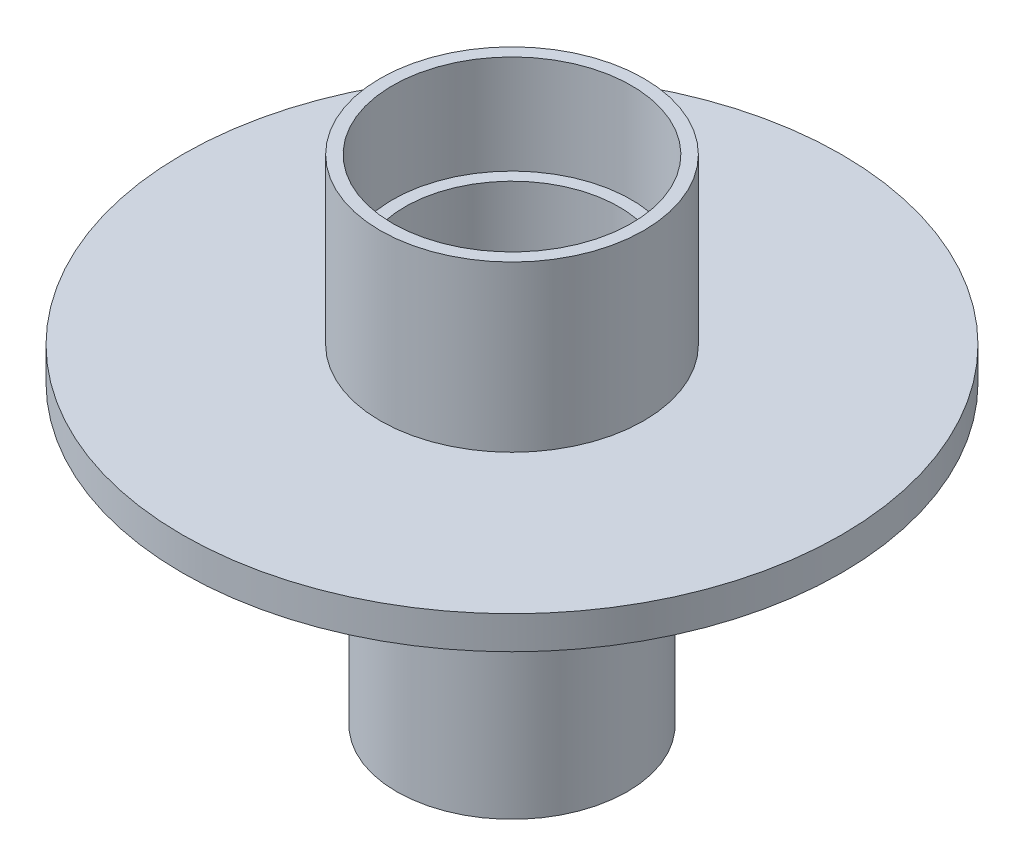
ISO-10303-21;
HEADER;
FILE_DESCRIPTION(('STEP AP214'),'2;1');
FILE_NAME('part.step','',(''),(''),'','','');
FILE_SCHEMA(('AUTOMOTIVE_DESIGN { 1 0 10303 214 1 1 1 1 }'));
ENDSEC;
DATA;
#1=APPLICATION_CONTEXT('core data for automotive mechanical design processes');
#2=APPLICATION_PROTOCOL_DEFINITION('international standard','automotive_design',2000,#1);
#3=PRODUCT_CONTEXT('',#1,'mechanical');
#4=PRODUCT('Part','Part','',(#3));
#5=PRODUCT_RELATED_PRODUCT_CATEGORY('part','',(#4));
#6=PRODUCT_DEFINITION_FORMATION('','',#4);
#7=PRODUCT_DEFINITION_CONTEXT('part definition',#1,'design');
#8=PRODUCT_DEFINITION('design','',#6,#7);
#9=PRODUCT_DEFINITION_SHAPE('','',#8);
#10=(LENGTH_UNIT() NAMED_UNIT(*) SI_UNIT(.MILLI.,.METRE.));
#11=(NAMED_UNIT(*) PLANE_ANGLE_UNIT() SI_UNIT($,.RADIAN.));
#12=(NAMED_UNIT(*) SI_UNIT($,.STERADIAN.) SOLID_ANGLE_UNIT());
#13=UNCERTAINTY_MEASURE_WITH_UNIT(LENGTH_MEASURE(1.E-05),#10,'distance_accuracy_value','');
#14=(GEOMETRIC_REPRESENTATION_CONTEXT(3) GLOBAL_UNCERTAINTY_ASSIGNED_CONTEXT((#13)) GLOBAL_UNIT_ASSIGNED_CONTEXT((#10,
#11,#12)) REPRESENTATION_CONTEXT('',''));
#15=CARTESIAN_POINT('',(0.,0.,0.));
#16=DIRECTION('',(0.,0.,1.));
#17=DIRECTION('',(1.,0.,0.));
#18=AXIS2_PLACEMENT_3D('',#15,#16,#17);
#19=CARTESIAN_POINT('',(0.,-0.626106049824934,40.));
#20=DIRECTION('',(0.,-1.,0.));
#21=DIRECTION('',(0.,0.,-1.));
#22=AXIS2_PLACEMENT_3D('',#19,#20,#21);
#23=PLANE('',#22);
#24=CARTESIAN_POINT('',(0.,-0.626106049824934,0.));
#25=DIRECTION('',(0.,1.,0.));
#26=DIRECTION('',(0.,0.,1.));
#27=AXIS2_PLACEMENT_3D('',#24,#25,#26);
#28=CIRCLE('',#27,14.);
#29=CARTESIAN_POINT('',(0.,-0.626106049824934,14.));
#30=VERTEX_POINT('',#29);
#31=EDGE_CURVE('E80',#30,#30,#28,.T.);
#32=ORIENTED_EDGE('',*,*,#31,.T.);
#33=EDGE_LOOP('',(#32));
#34=FACE_BOUND('',#33,.T.);
#35=CARTESIAN_POINT('',(0.,-0.626106049824934,0.));
#36=DIRECTION('',(0.,1.,0.));
#37=DIRECTION('',(0.,0.,1.));
#38=AXIS2_PLACEMENT_3D('',#35,#36,#37);
#39=CIRCLE('',#38,40.);
#40=CARTESIAN_POINT('',(0.,-0.626106049824934,40.));
#41=VERTEX_POINT('',#40);
#42=EDGE_CURVE('E10',#41,#41,#39,.T.);
#43=ORIENTED_EDGE('',*,*,#42,.F.);
#44=EDGE_LOOP('',(#43));
#45=FACE_BOUND('',#44,.T.);
#46=ADVANCED_FACE('F37',(#34,#45),#23,.T.);
#47=CARTESIAN_POINT('',(0.,28.0586262240942,0.));
#48=DIRECTION('',(0.,1.,0.));
#49=DIRECTION('',(0.,0.,1.));
#50=AXIS2_PLACEMENT_3D('',#47,#48,#49);
#51=CYLINDRICAL_SURFACE('',#50,40.);
#52=ORIENTED_EDGE('',*,*,#42,.T.);
#53=EDGE_LOOP('',(#52));
#54=FACE_BOUND('',#53,.T.);
#55=CARTESIAN_POINT('',(0.,3.37389395017507,0.));
#56=DIRECTION('',(0.,1.,0.));
#57=DIRECTION('',(0.,0.,1.));
#58=AXIS2_PLACEMENT_3D('',#55,#56,#57);
#59=CIRCLE('',#58,40.);
#60=CARTESIAN_POINT('',(0.,3.37389395017507,40.));
#61=VERTEX_POINT('',#60);
#62=EDGE_CURVE('E44',#61,#61,#59,.T.);
#63=ORIENTED_EDGE('',*,*,#62,.F.);
#64=EDGE_LOOP('',(#63));
#65=FACE_BOUND('',#64,.T.);
#66=ADVANCED_FACE('F99',(#54,#65),#51,.T.);
#67=CARTESIAN_POINT('',(0.,3.37389395017507,16.));
#68=DIRECTION('',(0.,1.,0.));
#69=DIRECTION('',(0.,0.,1.));
#70=AXIS2_PLACEMENT_3D('',#67,#68,#69);
#71=PLANE('',#70);
#72=ORIENTED_EDGE('',*,*,#62,.T.);
#73=EDGE_LOOP('',(#72));
#74=FACE_BOUND('',#73,.T.);
#75=CARTESIAN_POINT('',(0.,3.37389395017507,0.));
#76=DIRECTION('',(0.,1.,0.));
#77=DIRECTION('',(0.,0.,1.));
#78=AXIS2_PLACEMENT_3D('',#75,#76,#77);
#79=CIRCLE('',#78,16.);
#80=CARTESIAN_POINT('',(0.,3.37389395017507,16.));
#81=VERTEX_POINT('',#80);
#82=EDGE_CURVE('E49',#81,#81,#79,.T.);
#83=ORIENTED_EDGE('',*,*,#82,.F.);
#84=EDGE_LOOP('',(#83));
#85=FACE_BOUND('',#84,.T.);
#86=ADVANCED_FACE('F103',(#74,#85),#71,.T.);
#87=CARTESIAN_POINT('',(0.,28.0586262240942,0.));
#88=DIRECTION('',(0.,1.,0.));
#89=DIRECTION('',(0.,0.,1.));
#90=AXIS2_PLACEMENT_3D('',#87,#88,#89);
#91=CYLINDRICAL_SURFACE('',#90,16.);
#92=ORIENTED_EDGE('',*,*,#82,.T.);
#93=EDGE_LOOP('',(#92));
#94=FACE_BOUND('',#93,.T.);
#95=CARTESIAN_POINT('',(0.,23.3738939501751,0.));
#96=DIRECTION('',(0.,1.,0.));
#97=DIRECTION('',(0.,0.,1.));
#98=AXIS2_PLACEMENT_3D('',#95,#96,#97);
#99=CIRCLE('',#98,16.);
#100=CARTESIAN_POINT('',(0.,23.3738939501751,16.));
#101=VERTEX_POINT('',#100);
#102=EDGE_CURVE('E54',#101,#101,#99,.T.);
#103=ORIENTED_EDGE('',*,*,#102,.F.);
#104=EDGE_LOOP('',(#103));
#105=FACE_BOUND('',#104,.T.);
#106=ADVANCED_FACE('F107',(#94,#105),#91,.T.);
#107=CARTESIAN_POINT('',(0.,23.3738939501751,16.));
#108=DIRECTION('',(0.,1.,0.));
#109=DIRECTION('',(0.,0.,1.));
#110=AXIS2_PLACEMENT_3D('',#107,#108,#109);
#111=PLANE('',#110);
#112=ORIENTED_EDGE('',*,*,#102,.T.);
#113=EDGE_LOOP('',(#112));
#114=FACE_BOUND('',#113,.T.);
#115=CARTESIAN_POINT('',(0.,23.3738939501751,0.));
#116=DIRECTION('',(0.,1.,0.));
#117=DIRECTION('',(0.,0.,1.));
#118=AXIS2_PLACEMENT_3D('',#115,#116,#117);
#119=CIRCLE('',#118,14.5);
#120=CARTESIAN_POINT('',(0.,23.3738939501751,14.5));
#121=VERTEX_POINT('',#120);
#122=EDGE_CURVE('E60',#121,#121,#119,.T.);
#123=ORIENTED_EDGE('',*,*,#122,.F.);
#124=EDGE_LOOP('',(#123));
#125=FACE_BOUND('',#124,.T.);
#126=ADVANCED_FACE('F113',(#114,#125),#111,.T.);
#127=CARTESIAN_POINT('',(0.,28.0586262240942,0.));
#128=DIRECTION('',(0.,1.,0.));
#129=DIRECTION('',(0.,0.,1.));
#130=AXIS2_PLACEMENT_3D('',#127,#128,#129);
#131=CYLINDRICAL_SURFACE('',#130,14.5);
#132=ORIENTED_EDGE('',*,*,#122,.T.);
#133=EDGE_LOOP('',(#132));
#134=FACE_BOUND('',#133,.T.);
#135=CARTESIAN_POINT('',(0.,11.3738939501751,0.));
#136=DIRECTION('',(0.,1.,0.));
#137=DIRECTION('',(0.,0.,1.));
#138=AXIS2_PLACEMENT_3D('',#135,#136,#137);
#139=CIRCLE('',#138,14.5);
#140=CARTESIAN_POINT('',(0.,11.3738939501751,14.5));
#141=VERTEX_POINT('',#140);
#142=EDGE_CURVE('E64',#141,#141,#139,.T.);
#143=ORIENTED_EDGE('',*,*,#142,.F.);
#144=EDGE_LOOP('',(#143));
#145=FACE_BOUND('',#144,.T.);
#146=ADVANCED_FACE('F117',(#134,#145),#131,.F.);
#147=CARTESIAN_POINT('',(0.,11.3738939501751,13.));
#148=DIRECTION('',(0.,1.,0.));
#149=DIRECTION('',(0.,0.,1.));
#150=AXIS2_PLACEMENT_3D('',#147,#148,#149);
#151=PLANE('',#150);
#152=ORIENTED_EDGE('',*,*,#142,.T.);
#153=EDGE_LOOP('',(#152));
#154=FACE_BOUND('',#153,.T.);
#155=CARTESIAN_POINT('',(0.,11.3738939501751,0.));
#156=DIRECTION('',(0.,1.,0.));
#157=DIRECTION('',(0.,0.,1.));
#158=AXIS2_PLACEMENT_3D('',#155,#156,#157);
#159=CIRCLE('',#158,13.);
#160=CARTESIAN_POINT('',(0.,11.3738939501751,13.));
#161=VERTEX_POINT('',#160);
#162=EDGE_CURVE('E68',#161,#161,#159,.T.);
#163=ORIENTED_EDGE('',*,*,#162,.F.);
#164=EDGE_LOOP('',(#163));
#165=FACE_BOUND('',#164,.T.);
#166=ADVANCED_FACE('F121',(#154,#165),#151,.T.);
#167=CARTESIAN_POINT('',(0.,28.0586262240942,0.));
#168=DIRECTION('',(0.,1.,0.));
#169=DIRECTION('',(0.,0.,1.));
#170=AXIS2_PLACEMENT_3D('',#167,#168,#169);
#171=CYLINDRICAL_SURFACE('',#170,13.);
#172=ORIENTED_EDGE('',*,*,#162,.T.);
#173=EDGE_LOOP('',(#172));
#174=FACE_BOUND('',#173,.T.);
#175=CARTESIAN_POINT('',(0.,-36.6261060498249,0.));
#176=DIRECTION('',(0.,1.,0.));
#177=DIRECTION('',(0.,0.,1.));
#178=AXIS2_PLACEMENT_3D('',#175,#176,#177);
#179=CIRCLE('',#178,13.);
#180=CARTESIAN_POINT('',(0.,-36.6261060498249,13.));
#181=VERTEX_POINT('',#180);
#182=EDGE_CURVE('E72',#181,#181,#179,.T.);
#183=ORIENTED_EDGE('',*,*,#182,.F.);
#184=EDGE_LOOP('',(#183));
#185=FACE_BOUND('',#184,.T.);
#186=ADVANCED_FACE('F95',(#174,#185),#171,.F.);
#187=CARTESIAN_POINT('',(0.,-36.6261060498249,14.));
#188=DIRECTION('',(0.,-1.,0.));
#189=DIRECTION('',(0.,0.,-1.));
#190=AXIS2_PLACEMENT_3D('',#187,#188,#189);
#191=PLANE('',#190);
#192=ORIENTED_EDGE('',*,*,#182,.T.);
#193=EDGE_LOOP('',(#192));
#194=FACE_BOUND('',#193,.T.);
#195=CARTESIAN_POINT('',(0.,-36.6261060498249,0.));
#196=DIRECTION('',(0.,1.,0.));
#197=DIRECTION('',(0.,0.,1.));
#198=AXIS2_PLACEMENT_3D('',#195,#196,#197);
#199=CIRCLE('',#198,14.);
#200=CARTESIAN_POINT('',(0.,-36.6261060498249,14.));
#201=VERTEX_POINT('',#200);
#202=EDGE_CURVE('E76',#201,#201,#199,.T.);
#203=ORIENTED_EDGE('',*,*,#202,.F.);
#204=EDGE_LOOP('',(#203));
#205=FACE_BOUND('',#204,.T.);
#206=ADVANCED_FACE('F89',(#194,#205),#191,.T.);
#207=CARTESIAN_POINT('',(0.,28.0586262240942,0.));
#208=DIRECTION('',(0.,1.,0.));
#209=DIRECTION('',(0.,0.,1.));
#210=AXIS2_PLACEMENT_3D('',#207,#208,#209);
#211=CYLINDRICAL_SURFACE('',#210,14.);
#212=ORIENTED_EDGE('',*,*,#202,.T.);
#213=EDGE_LOOP('',(#212));
#214=FACE_BOUND('',#213,.T.);
#215=ORIENTED_EDGE('',*,*,#31,.F.);
#216=EDGE_LOOP('',(#215));
#217=FACE_BOUND('',#216,.T.);
#218=ADVANCED_FACE('F87',(#214,#217),#211,.T.);
#219=CLOSED_SHELL('',(#46,#66,#86,#106,#126,#146,#166,#186,#206,#218));
#220=MANIFOLD_SOLID_BREP('B2',#219);
#221=ADVANCED_BREP_SHAPE_REPRESENTATION('',(#18,#220),#14);
#222=SHAPE_DEFINITION_REPRESENTATION(#9,#221);
ENDSEC;
END-ISO-10303-21;
